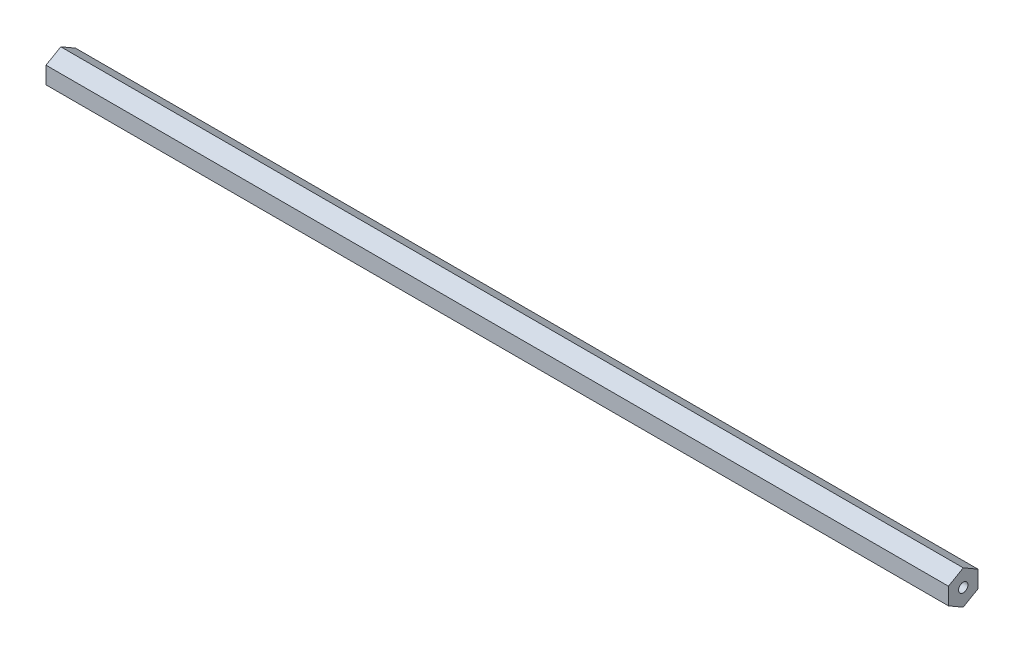
ISO-10303-21;
HEADER;
FILE_DESCRIPTION(('STEP AP214'),'2;1');
FILE_NAME('part.step','',(''),(''),'','','');
FILE_SCHEMA(('AUTOMOTIVE_DESIGN { 1 0 10303 214 1 1 1 1 }'));
ENDSEC;
DATA;
#1=APPLICATION_CONTEXT('core data for automotive mechanical design processes');
#2=APPLICATION_PROTOCOL_DEFINITION('international standard','automotive_design',2000,#1);
#3=PRODUCT_CONTEXT('',#1,'mechanical');
#4=PRODUCT('Part','Part','',(#3));
#5=PRODUCT_RELATED_PRODUCT_CATEGORY('part','',(#4));
#6=PRODUCT_DEFINITION_FORMATION('','',#4);
#7=PRODUCT_DEFINITION_CONTEXT('part definition',#1,'design');
#8=PRODUCT_DEFINITION('design','',#6,#7);
#9=PRODUCT_DEFINITION_SHAPE('','',#8);
#10=(LENGTH_UNIT() NAMED_UNIT(*) SI_UNIT(.MILLI.,.METRE.));
#11=(NAMED_UNIT(*) PLANE_ANGLE_UNIT() SI_UNIT($,.RADIAN.));
#12=(NAMED_UNIT(*) SI_UNIT($,.STERADIAN.) SOLID_ANGLE_UNIT());
#13=UNCERTAINTY_MEASURE_WITH_UNIT(LENGTH_MEASURE(1.E-05),#10,'distance_accuracy_value','');
#14=(GEOMETRIC_REPRESENTATION_CONTEXT(3) GLOBAL_UNCERTAINTY_ASSIGNED_CONTEXT((#13)) GLOBAL_UNIT_ASSIGNED_CONTEXT((#10,
#11,#12)) REPRESENTATION_CONTEXT('',''));
#15=CARTESIAN_POINT('',(0.,0.,0.));
#16=DIRECTION('',(0.,0.,1.));
#17=DIRECTION('',(1.,0.,0.));
#18=AXIS2_PLACEMENT_3D('',#15,#16,#17);
#19=CARTESIAN_POINT('',(194.071875,0.,-6.35));
#20=DIRECTION('',(0.,0.,1.));
#21=DIRECTION('',(0.,-1.,0.));
#22=AXIS2_PLACEMENT_3D('',#19,#20,#21);
#23=PLANE('',#22);
#24=DIRECTION('',(0.,1.,0.));
#25=VECTOR('',#24,1.);
#26=CARTESIAN_POINT('',(-194.071875,0.,-6.35));
#27=LINE('',#26,#25);
#28=CARTESIAN_POINT('',(-194.071875,-3.66617420935412,-6.35));
#29=VERTEX_POINT('',#28);
#30=CARTESIAN_POINT('',(-194.071875,3.66617420935413,-6.35));
#31=VERTEX_POINT('',#30);
#32=EDGE_CURVE('E132',#29,#31,#27,.T.);
#33=ORIENTED_EDGE('',*,*,#32,.T.);
#34=DIRECTION('',(-1.,0.,0.));
#35=VECTOR('',#34,1.);
#36=CARTESIAN_POINT('',(194.071875,3.66617420935413,-6.35));
#37=LINE('',#36,#35);
#38=CARTESIAN_POINT('',(194.071875,3.66617420935413,-6.35));
#39=VERTEX_POINT('',#38);
#40=EDGE_CURVE('E11',#39,#31,#37,.T.);
#41=ORIENTED_EDGE('',*,*,#40,.F.);
#42=DIRECTION('',(0.,1.,0.));
#43=VECTOR('',#42,1.);
#44=CARTESIAN_POINT('',(194.071875,0.,-6.35));
#45=LINE('',#44,#43);
#46=CARTESIAN_POINT('',(194.071875,-3.66617420935412,-6.35));
#47=VERTEX_POINT('',#46);
#48=EDGE_CURVE('E143',#47,#39,#45,.T.);
#49=ORIENTED_EDGE('',*,*,#48,.F.);
#50=DIRECTION('',(-1.,0.,0.));
#51=VECTOR('',#50,1.);
#52=CARTESIAN_POINT('',(194.071875,-3.66617420935412,-6.35));
#53=LINE('',#52,#51);
#54=EDGE_CURVE('E128',#47,#29,#53,.T.);
#55=ORIENTED_EDGE('',*,*,#54,.T.);
#56=EDGE_LOOP('',(#33,#41,#49,#55));
#57=FACE_BOUND('',#56,.T.);
#58=ADVANCED_FACE('F45',(#57),#23,.F.);
#59=CARTESIAN_POINT('',(194.071875,5.49926131403119,-3.175));
#60=DIRECTION('',(0.,-0.866025403784439,0.5));
#61=DIRECTION('',(0.,-0.5,-0.866025403784439));
#62=AXIS2_PLACEMENT_3D('',#59,#60,#61);
#63=PLANE('',#62);
#64=DIRECTION('',(0.,0.5,0.866025403784439));
#65=VECTOR('',#64,1.);
#66=CARTESIAN_POINT('',(-194.071875,5.49926131403119,-3.175));
#67=LINE('',#66,#65);
#68=CARTESIAN_POINT('',(-194.071875,7.33234841870825,0.));
#69=VERTEX_POINT('',#68);
#70=EDGE_CURVE('E135',#31,#69,#67,.T.);
#71=ORIENTED_EDGE('',*,*,#70,.T.);
#72=DIRECTION('',(-1.,0.,0.));
#73=VECTOR('',#72,1.);
#74=CARTESIAN_POINT('',(194.071875,7.33234841870825,0.));
#75=LINE('',#74,#73);
#76=CARTESIAN_POINT('',(194.071875,7.33234841870825,0.));
#77=VERTEX_POINT('',#76);
#78=EDGE_CURVE('E53',#77,#69,#75,.T.);
#79=ORIENTED_EDGE('',*,*,#78,.F.);
#80=DIRECTION('',(0.,0.5,0.866025403784439));
#81=VECTOR('',#80,1.);
#82=CARTESIAN_POINT('',(194.071875,5.49926131403119,-3.175));
#83=LINE('',#82,#81);
#84=EDGE_CURVE('E99',#39,#77,#83,.T.);
#85=ORIENTED_EDGE('',*,*,#84,.F.);
#86=ORIENTED_EDGE('',*,*,#40,.T.);
#87=EDGE_LOOP('',(#71,#79,#85,#86));
#88=FACE_BOUND('',#87,.T.);
#89=ADVANCED_FACE('F168',(#88),#63,.F.);
#90=CARTESIAN_POINT('',(194.071875,5.49926131403118,3.175));
#91=DIRECTION('',(0.,-0.866025403784438,-0.5));
#92=DIRECTION('',(0.,0.5,-0.866025403784439));
#93=AXIS2_PLACEMENT_3D('',#90,#91,#92);
#94=PLANE('',#93);
#95=DIRECTION('',(0.,-0.5,0.866025403784439));
#96=VECTOR('',#95,1.);
#97=CARTESIAN_POINT('',(-194.071875,5.49926131403118,3.175));
#98=LINE('',#97,#96);
#99=CARTESIAN_POINT('',(-194.071875,3.66617420935412,6.35));
#100=VERTEX_POINT('',#99);
#101=EDGE_CURVE('E138',#69,#100,#98,.T.);
#102=ORIENTED_EDGE('',*,*,#101,.T.);
#103=DIRECTION('',(-1.,0.,0.));
#104=VECTOR('',#103,1.);
#105=CARTESIAN_POINT('',(194.071875,3.66617420935412,6.35));
#106=LINE('',#105,#104);
#107=CARTESIAN_POINT('',(194.071875,3.66617420935412,6.35));
#108=VERTEX_POINT('',#107);
#109=EDGE_CURVE('E123',#108,#100,#106,.T.);
#110=ORIENTED_EDGE('',*,*,#109,.F.);
#111=DIRECTION('',(0.,-0.5,0.866025403784439));
#112=VECTOR('',#111,1.);
#113=CARTESIAN_POINT('',(194.071875,5.49926131403118,3.175));
#114=LINE('',#113,#112);
#115=EDGE_CURVE('E114',#77,#108,#114,.T.);
#116=ORIENTED_EDGE('',*,*,#115,.F.);
#117=ORIENTED_EDGE('',*,*,#78,.T.);
#118=EDGE_LOOP('',(#102,#110,#116,#117));
#119=FACE_BOUND('',#118,.T.);
#120=ADVANCED_FACE('F149',(#119),#94,.F.);
#121=CARTESIAN_POINT('',(194.071875,0.,6.35));
#122=DIRECTION('',(0.,0.,-1.));
#123=DIRECTION('',(0.,1.,0.));
#124=AXIS2_PLACEMENT_3D('',#121,#122,#123);
#125=PLANE('',#124);
#126=DIRECTION('',(0.,-1.,0.));
#127=VECTOR('',#126,1.);
#128=CARTESIAN_POINT('',(-194.071875,0.,6.35));
#129=LINE('',#128,#127);
#130=CARTESIAN_POINT('',(-194.071875,-3.66617420935413,6.35));
#131=VERTEX_POINT('',#130);
#132=EDGE_CURVE('E122',#100,#131,#129,.T.);
#133=ORIENTED_EDGE('',*,*,#132,.T.);
#134=DIRECTION('',(-1.,0.,0.));
#135=VECTOR('',#134,1.);
#136=CARTESIAN_POINT('',(194.071875,-3.66617420935413,6.35));
#137=LINE('',#136,#135);
#138=CARTESIAN_POINT('',(194.071875,-3.66617420935413,6.35));
#139=VERTEX_POINT('',#138);
#140=EDGE_CURVE('E119',#139,#131,#137,.T.);
#141=ORIENTED_EDGE('',*,*,#140,.F.);
#142=DIRECTION('',(0.,-1.,0.));
#143=VECTOR('',#142,1.);
#144=CARTESIAN_POINT('',(194.071875,0.,6.35));
#145=LINE('',#144,#143);
#146=EDGE_CURVE('E108',#108,#139,#145,.T.);
#147=ORIENTED_EDGE('',*,*,#146,.F.);
#148=ORIENTED_EDGE('',*,*,#109,.T.);
#149=EDGE_LOOP('',(#133,#141,#147,#148));
#150=FACE_BOUND('',#149,.T.);
#151=ADVANCED_FACE('F120',(#150),#125,.F.);
#152=CARTESIAN_POINT('',(194.071875,-5.49926131403119,3.175));
#153=DIRECTION('',(0.,0.866025403784439,-0.5));
#154=DIRECTION('',(0.,0.5,0.866025403784439));
#155=AXIS2_PLACEMENT_3D('',#152,#153,#154);
#156=PLANE('',#155);
#157=DIRECTION('',(0.,-0.5,-0.866025403784439));
#158=VECTOR('',#157,1.);
#159=CARTESIAN_POINT('',(-194.071875,-5.49926131403119,3.175));
#160=LINE('',#159,#158);
#161=CARTESIAN_POINT('',(-194.071875,-7.33234841870825,0.));
#162=VERTEX_POINT('',#161);
#163=EDGE_CURVE('E85',#131,#162,#160,.T.);
#164=ORIENTED_EDGE('',*,*,#163,.T.);
#165=DIRECTION('',(-1.,0.,0.));
#166=VECTOR('',#165,1.);
#167=CARTESIAN_POINT('',(194.071875,-7.33234841870825,0.));
#168=LINE('',#167,#166);
#169=CARTESIAN_POINT('',(194.071875,-7.33234841870825,0.));
#170=VERTEX_POINT('',#169);
#171=EDGE_CURVE('E124',#170,#162,#168,.T.);
#172=ORIENTED_EDGE('',*,*,#171,.F.);
#173=DIRECTION('',(0.,-0.5,-0.866025403784439));
#174=VECTOR('',#173,1.);
#175=CARTESIAN_POINT('',(194.071875,-5.49926131403119,3.175));
#176=LINE('',#175,#174);
#177=EDGE_CURVE('E112',#139,#170,#176,.T.);
#178=ORIENTED_EDGE('',*,*,#177,.F.);
#179=ORIENTED_EDGE('',*,*,#140,.T.);
#180=EDGE_LOOP('',(#164,#172,#178,#179));
#181=FACE_BOUND('',#180,.T.);
#182=ADVANCED_FACE('F126',(#181),#156,.F.);
#183=CARTESIAN_POINT('',(194.071875,-5.49926131403118,-3.175));
#184=DIRECTION('',(0.,0.866025403784439,0.5));
#185=DIRECTION('',(0.,-0.5,0.866025403784439));
#186=AXIS2_PLACEMENT_3D('',#183,#184,#185);
#187=PLANE('',#186);
#188=DIRECTION('',(0.,0.5,-0.866025403784439));
#189=VECTOR('',#188,1.);
#190=CARTESIAN_POINT('',(-194.071875,-5.49926131403118,-3.175));
#191=LINE('',#190,#189);
#192=EDGE_CURVE('E91',#162,#29,#191,.T.);
#193=ORIENTED_EDGE('',*,*,#192,.T.);
#194=ORIENTED_EDGE('',*,*,#54,.F.);
#195=DIRECTION('',(0.,0.5,-0.866025403784439));
#196=VECTOR('',#195,1.);
#197=CARTESIAN_POINT('',(194.071875,-5.49926131403118,-3.175));
#198=LINE('',#197,#196);
#199=EDGE_CURVE('E61',#170,#47,#198,.T.);
#200=ORIENTED_EDGE('',*,*,#199,.F.);
#201=ORIENTED_EDGE('',*,*,#171,.T.);
#202=EDGE_LOOP('',(#193,#194,#200,#201));
#203=FACE_BOUND('',#202,.T.);
#204=ADVANCED_FACE('F156',(#203),#187,.F.);
#205=CARTESIAN_POINT('',(194.071875,0.,0.));
#206=DIRECTION('',(1.,0.,0.));
#207=DIRECTION('',(0.,0.,-1.));
#208=AXIS2_PLACEMENT_3D('',#205,#206,#207);
#209=PLANE('',#208);
#210=CARTESIAN_POINT('',(194.071875,0.,0.));
#211=DIRECTION('',(1.,0.,0.));
#212=DIRECTION('',(0.,0.,-1.));
#213=AXIS2_PLACEMENT_3D('',#210,#211,#212);
#214=CIRCLE('',#213,2.01929999999999);
#215=CARTESIAN_POINT('',(194.071875,0.,-2.01929999999999));
#216=VERTEX_POINT('',#215);
#217=EDGE_CURVE('E312',#216,#216,#214,.T.);
#218=ORIENTED_EDGE('',*,*,#217,.F.);
#219=EDGE_LOOP('',(#218));
#220=FACE_BOUND('',#219,.T.);
#221=ORIENTED_EDGE('',*,*,#48,.T.);
#222=ORIENTED_EDGE('',*,*,#84,.T.);
#223=ORIENTED_EDGE('',*,*,#115,.T.);
#224=ORIENTED_EDGE('',*,*,#146,.T.);
#225=ORIENTED_EDGE('',*,*,#177,.T.);
#226=ORIENTED_EDGE('',*,*,#199,.T.);
#227=EDGE_LOOP('',(#221,#222,#223,#224,#225,#226));
#228=FACE_BOUND('',#227,.T.);
#229=ADVANCED_FACE('F110',(#220,#228),#209,.T.);
#230=CARTESIAN_POINT('',(-194.071875,0.,0.));
#231=DIRECTION('',(1.,0.,0.));
#232=DIRECTION('',(0.,0.,-1.));
#233=AXIS2_PLACEMENT_3D('',#230,#231,#232);
#234=PLANE('',#233);
#235=CARTESIAN_POINT('',(-194.071875,0.,0.));
#236=DIRECTION('',(-1.,0.,0.));
#237=DIRECTION('',(0.,0.,1.));
#238=AXIS2_PLACEMENT_3D('',#235,#236,#237);
#239=CIRCLE('',#238,2.01929999999999);
#240=CARTESIAN_POINT('',(-194.071875,0.,2.01929999999999));
#241=VERTEX_POINT('',#240);
#242=EDGE_CURVE('E314',#241,#241,#239,.T.);
#243=ORIENTED_EDGE('',*,*,#242,.F.);
#244=EDGE_LOOP('',(#243));
#245=FACE_BOUND('',#244,.T.);
#246=ORIENTED_EDGE('',*,*,#32,.F.);
#247=ORIENTED_EDGE('',*,*,#192,.F.);
#248=ORIENTED_EDGE('',*,*,#163,.F.);
#249=ORIENTED_EDGE('',*,*,#132,.F.);
#250=ORIENTED_EDGE('',*,*,#101,.F.);
#251=ORIENTED_EDGE('',*,*,#70,.F.);
#252=EDGE_LOOP('',(#246,#247,#248,#249,#250,#251));
#253=FACE_BOUND('',#252,.T.);
#254=ADVANCED_FACE('F152',(#245,#253),#234,.F.);
#255=CARTESIAN_POINT('',(-177.724435,0.,0.));
#256=DIRECTION('',(-1.,0.,0.));
#257=DIRECTION('',(0.,0.,1.));
#258=AXIS2_PLACEMENT_3D('',#255,#256,#257);
#259=CONICAL_SURFACE('',#258,2.01929999999999,1.02974425867665);
#260=CARTESIAN_POINT('',(-176.511117151998,0.,0.));
#261=VERTEX_POINT('',#260);
#262=VERTEX_LOOP('',#261);
#263=FACE_BOUND('',#262,.T.);
#264=CARTESIAN_POINT('',(-177.724435,0.,0.));
#265=DIRECTION('',(-1.,0.,0.));
#266=DIRECTION('',(0.,0.,1.));
#267=AXIS2_PLACEMENT_3D('',#264,#265,#266);
#268=CIRCLE('',#267,2.01929999999999);
#269=CARTESIAN_POINT('',(-177.724435,0.,2.01929999999999));
#270=VERTEX_POINT('',#269);
#271=EDGE_CURVE('E136',#270,#270,#268,.T.);
#272=ORIENTED_EDGE('',*,*,#271,.T.);
#273=EDGE_LOOP('',(#272));
#274=FACE_BOUND('',#273,.T.);
#275=ADVANCED_FACE('F212',(#263,#274),#259,.F.);
#276=CARTESIAN_POINT('',(-194.071875,0.,0.));
#277=DIRECTION('',(-1.,0.,0.));
#278=DIRECTION('',(0.,0.,1.));
#279=AXIS2_PLACEMENT_3D('',#276,#277,#278);
#280=CYLINDRICAL_SURFACE('',#279,2.01929999999999);
#281=ORIENTED_EDGE('',*,*,#271,.F.);
#282=EDGE_LOOP('',(#281));
#283=FACE_BOUND('',#282,.T.);
#284=ORIENTED_EDGE('',*,*,#242,.T.);
#285=EDGE_LOOP('',(#284));
#286=FACE_BOUND('',#285,.T.);
#287=ADVANCED_FACE('F224',(#283,#286),#280,.F.);
#288=CARTESIAN_POINT('',(177.724435,0.,0.));
#289=DIRECTION('',(1.,0.,0.));
#290=DIRECTION('',(0.,0.,-1.));
#291=AXIS2_PLACEMENT_3D('',#288,#289,#290);
#292=CONICAL_SURFACE('',#291,2.01929999999999,1.02974425867665);
#293=CARTESIAN_POINT('',(176.511117151998,0.,0.));
#294=VERTEX_POINT('',#293);
#295=VERTEX_LOOP('',#294);
#296=FACE_BOUND('',#295,.T.);
#297=CARTESIAN_POINT('',(177.724435,0.,0.));
#298=DIRECTION('',(1.,0.,0.));
#299=DIRECTION('',(0.,0.,-1.));
#300=AXIS2_PLACEMENT_3D('',#297,#298,#299);
#301=CIRCLE('',#300,2.01929999999999);
#302=CARTESIAN_POINT('',(177.724435,0.,-2.01929999999999));
#303=VERTEX_POINT('',#302);
#304=EDGE_CURVE('E309',#303,#303,#301,.T.);
#305=ORIENTED_EDGE('',*,*,#304,.T.);
#306=EDGE_LOOP('',(#305));
#307=FACE_BOUND('',#306,.T.);
#308=ADVANCED_FACE('F236',(#296,#307),#292,.F.);
#309=CARTESIAN_POINT('',(194.071875,0.,0.));
#310=DIRECTION('',(1.,0.,0.));
#311=DIRECTION('',(0.,0.,-1.));
#312=AXIS2_PLACEMENT_3D('',#309,#310,#311);
#313=CYLINDRICAL_SURFACE('',#312,2.01929999999999);
#314=ORIENTED_EDGE('',*,*,#304,.F.);
#315=EDGE_LOOP('',(#314));
#316=FACE_BOUND('',#315,.T.);
#317=ORIENTED_EDGE('',*,*,#217,.T.);
#318=EDGE_LOOP('',(#317));
#319=FACE_BOUND('',#318,.T.);
#320=ADVANCED_FACE('F249',(#316,#319),#313,.F.);
#321=CLOSED_SHELL('',(#58,#89,#120,#151,#182,#204,#229,#254,#275,#287,#308,#320));
#322=MANIFOLD_SOLID_BREP('B2',#321);
#323=ADVANCED_BREP_SHAPE_REPRESENTATION('',(#18,#322),#14);
#324=SHAPE_DEFINITION_REPRESENTATION(#9,#323);
ENDSEC;
END-ISO-10303-21;
